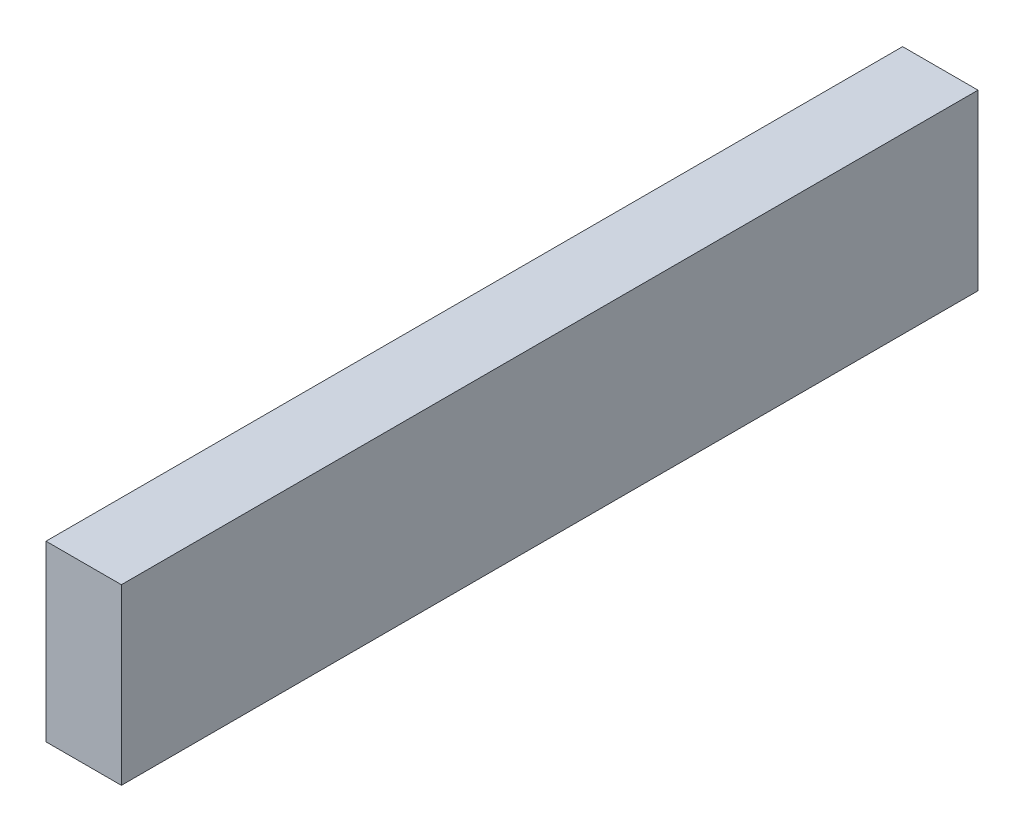
ISO-10303-21;
HEADER;
FILE_DESCRIPTION(('STEP AP214'),'2;1');
FILE_NAME('part.step','',(''),(''),'','','');
FILE_SCHEMA(('AUTOMOTIVE_DESIGN { 1 0 10303 214 1 1 1 1 }'));
ENDSEC;
DATA;
#1=APPLICATION_CONTEXT('core data for automotive mechanical design processes');
#2=APPLICATION_PROTOCOL_DEFINITION('international standard','automotive_design',2000,#1);
#3=PRODUCT_CONTEXT('',#1,'mechanical');
#4=PRODUCT('Part','Part','',(#3));
#5=PRODUCT_RELATED_PRODUCT_CATEGORY('part','',(#4));
#6=PRODUCT_DEFINITION_FORMATION('','',#4);
#7=PRODUCT_DEFINITION_CONTEXT('part definition',#1,'design');
#8=PRODUCT_DEFINITION('design','',#6,#7);
#9=PRODUCT_DEFINITION_SHAPE('','',#8);
#10=(LENGTH_UNIT() NAMED_UNIT(*) SI_UNIT(.MILLI.,.METRE.));
#11=(NAMED_UNIT(*) PLANE_ANGLE_UNIT() SI_UNIT($,.RADIAN.));
#12=(NAMED_UNIT(*) SI_UNIT($,.STERADIAN.) SOLID_ANGLE_UNIT());
#13=UNCERTAINTY_MEASURE_WITH_UNIT(LENGTH_MEASURE(1.E-05),#10,'distance_accuracy_value','');
#14=(GEOMETRIC_REPRESENTATION_CONTEXT(3) GLOBAL_UNCERTAINTY_ASSIGNED_CONTEXT((#13)) GLOBAL_UNIT_ASSIGNED_CONTEXT((#10,
#11,#12)) REPRESENTATION_CONTEXT('',''));
#15=CARTESIAN_POINT('',(0.,0.,0.));
#16=DIRECTION('',(0.,0.,1.));
#17=DIRECTION('',(1.,0.,0.));
#18=AXIS2_PLACEMENT_3D('',#15,#16,#17);
#19=CARTESIAN_POINT('',(0.,0.,431.8));
#20=DIRECTION('',(0.,1.,0.));
#21=DIRECTION('',(-1.,0.,0.));
#22=AXIS2_PLACEMENT_3D('',#19,#20,#21);
#23=PLANE('',#22);
#24=DIRECTION('',(1.,0.,0.));
#25=VECTOR('',#24,1.);
#26=CARTESIAN_POINT('',(0.,0.,0.));
#27=LINE('',#26,#25);
#28=CARTESIAN_POINT('',(-38.,0.,0.));
#29=VERTEX_POINT('',#28);
#30=CARTESIAN_POINT('',(0.,0.,0.));
#31=VERTEX_POINT('',#30);
#32=EDGE_CURVE('E113',#29,#31,#27,.T.);
#33=ORIENTED_EDGE('',*,*,#32,.T.);
#34=DIRECTION('',(0.,0.,-1.));
#35=VECTOR('',#34,1.);
#36=CARTESIAN_POINT('',(0.,0.,431.8));
#37=LINE('',#36,#35);
#38=CARTESIAN_POINT('',(0.,0.,431.8));
#39=VERTEX_POINT('',#38);
#40=EDGE_CURVE('E11',#39,#31,#37,.T.);
#41=ORIENTED_EDGE('',*,*,#40,.F.);
#42=DIRECTION('',(1.,0.,0.));
#43=VECTOR('',#42,1.);
#44=CARTESIAN_POINT('',(0.,0.,431.8));
#45=LINE('',#44,#43);
#46=CARTESIAN_POINT('',(-38.,0.,431.8));
#47=VERTEX_POINT('',#46);
#48=EDGE_CURVE('E97',#47,#39,#45,.T.);
#49=ORIENTED_EDGE('',*,*,#48,.F.);
#50=DIRECTION('',(0.,0.,-1.));
#51=VECTOR('',#50,1.);
#52=CARTESIAN_POINT('',(-38.,0.,431.8));
#53=LINE('',#52,#51);
#54=EDGE_CURVE('E109',#47,#29,#53,.T.);
#55=ORIENTED_EDGE('',*,*,#54,.T.);
#56=EDGE_LOOP('',(#33,#41,#49,#55));
#57=FACE_BOUND('',#56,.T.);
#58=ADVANCED_FACE('F45',(#57),#23,.F.);
#59=CARTESIAN_POINT('',(0.,0.,431.8));
#60=DIRECTION('',(-1.,0.,0.));
#61=DIRECTION('',(0.,0.,1.));
#62=AXIS2_PLACEMENT_3D('',#59,#60,#61);
#63=PLANE('',#62);
#64=DIRECTION('',(0.,1.,0.));
#65=VECTOR('',#64,1.);
#66=CARTESIAN_POINT('',(0.,0.,0.));
#67=LINE('',#66,#65);
#68=CARTESIAN_POINT('',(0.,87.6,0.));
#69=VERTEX_POINT('',#68);
#70=EDGE_CURVE('E102',#31,#69,#67,.T.);
#71=ORIENTED_EDGE('',*,*,#70,.T.);
#72=DIRECTION('',(0.,0.,-1.));
#73=VECTOR('',#72,1.);
#74=CARTESIAN_POINT('',(0.,87.6,431.8));
#75=LINE('',#74,#73);
#76=CARTESIAN_POINT('',(0.,87.6,431.8));
#77=VERTEX_POINT('',#76);
#78=EDGE_CURVE('E54',#77,#69,#75,.T.);
#79=ORIENTED_EDGE('',*,*,#78,.F.);
#80=DIRECTION('',(0.,1.,0.));
#81=VECTOR('',#80,1.);
#82=CARTESIAN_POINT('',(0.,0.,431.8));
#83=LINE('',#82,#81);
#84=EDGE_CURVE('E92',#39,#77,#83,.T.);
#85=ORIENTED_EDGE('',*,*,#84,.F.);
#86=ORIENTED_EDGE('',*,*,#40,.T.);
#87=EDGE_LOOP('',(#71,#79,#85,#86));
#88=FACE_BOUND('',#87,.T.);
#89=ADVANCED_FACE('F101',(#88),#63,.F.);
#90=CARTESIAN_POINT('',(0.,87.6,431.8));
#91=DIRECTION('',(0.,-1.,0.));
#92=DIRECTION('',(1.,0.,0.));
#93=AXIS2_PLACEMENT_3D('',#90,#91,#92);
#94=PLANE('',#93);
#95=DIRECTION('',(-1.,0.,0.));
#96=VECTOR('',#95,1.);
#97=CARTESIAN_POINT('',(0.,87.6,0.));
#98=LINE('',#97,#96);
#99=CARTESIAN_POINT('',(-38.,87.6,0.));
#100=VERTEX_POINT('',#99);
#101=EDGE_CURVE('E79',#69,#100,#98,.T.);
#102=ORIENTED_EDGE('',*,*,#101,.T.);
#103=DIRECTION('',(0.,0.,-1.));
#104=VECTOR('',#103,1.);
#105=CARTESIAN_POINT('',(-38.,87.6,431.8));
#106=LINE('',#105,#104);
#107=CARTESIAN_POINT('',(-38.,87.6,431.8));
#108=VERTEX_POINT('',#107);
#109=EDGE_CURVE('E104',#108,#100,#106,.T.);
#110=ORIENTED_EDGE('',*,*,#109,.F.);
#111=DIRECTION('',(-1.,0.,0.));
#112=VECTOR('',#111,1.);
#113=CARTESIAN_POINT('',(0.,87.6,431.8));
#114=LINE('',#113,#112);
#115=EDGE_CURVE('E95',#77,#108,#114,.T.);
#116=ORIENTED_EDGE('',*,*,#115,.F.);
#117=ORIENTED_EDGE('',*,*,#78,.T.);
#118=EDGE_LOOP('',(#102,#110,#116,#117));
#119=FACE_BOUND('',#118,.T.);
#120=ADVANCED_FACE('F105',(#119),#94,.F.);
#121=CARTESIAN_POINT('',(-38.,0.,431.8));
#122=DIRECTION('',(1.,0.,0.));
#123=DIRECTION('',(0.,0.,-1.));
#124=AXIS2_PLACEMENT_3D('',#121,#122,#123);
#125=PLANE('',#124);
#126=DIRECTION('',(0.,-1.,0.));
#127=VECTOR('',#126,1.);
#128=CARTESIAN_POINT('',(-38.,0.,0.));
#129=LINE('',#128,#127);
#130=EDGE_CURVE('E85',#100,#29,#129,.T.);
#131=ORIENTED_EDGE('',*,*,#130,.T.);
#132=ORIENTED_EDGE('',*,*,#54,.F.);
#133=DIRECTION('',(0.,-1.,0.));
#134=VECTOR('',#133,1.);
#135=CARTESIAN_POINT('',(-38.,0.,431.8));
#136=LINE('',#135,#134);
#137=EDGE_CURVE('E62',#108,#47,#136,.T.);
#138=ORIENTED_EDGE('',*,*,#137,.F.);
#139=ORIENTED_EDGE('',*,*,#109,.T.);
#140=EDGE_LOOP('',(#131,#132,#138,#139));
#141=FACE_BOUND('',#140,.T.);
#142=ADVANCED_FACE('F126',(#141),#125,.F.);
#143=CARTESIAN_POINT('',(0.,0.,431.8));
#144=DIRECTION('',(0.,0.,-1.));
#145=DIRECTION('',(-1.,0.,0.));
#146=AXIS2_PLACEMENT_3D('',#143,#144,#145);
#147=PLANE('',#146);
#148=ORIENTED_EDGE('',*,*,#48,.T.);
#149=ORIENTED_EDGE('',*,*,#84,.T.);
#150=ORIENTED_EDGE('',*,*,#115,.T.);
#151=ORIENTED_EDGE('',*,*,#137,.T.);
#152=EDGE_LOOP('',(#148,#149,#150,#151));
#153=FACE_BOUND('',#152,.T.);
#154=ADVANCED_FACE('F93',(#153),#147,.F.);
#155=CARTESIAN_POINT('',(0.,0.,0.));
#156=DIRECTION('',(0.,0.,-1.));
#157=DIRECTION('',(-1.,0.,0.));
#158=AXIS2_PLACEMENT_3D('',#155,#156,#157);
#159=PLANE('',#158);
#160=ORIENTED_EDGE('',*,*,#32,.F.);
#161=ORIENTED_EDGE('',*,*,#130,.F.);
#162=ORIENTED_EDGE('',*,*,#101,.F.);
#163=ORIENTED_EDGE('',*,*,#70,.F.);
#164=EDGE_LOOP('',(#160,#161,#162,#163));
#165=FACE_BOUND('',#164,.T.);
#166=ADVANCED_FACE('F129',(#165),#159,.T.);
#167=CLOSED_SHELL('',(#58,#89,#120,#142,#154,#166));
#168=MANIFOLD_SOLID_BREP('B2',#167);
#169=ADVANCED_BREP_SHAPE_REPRESENTATION('',(#18,#168),#14);
#170=SHAPE_DEFINITION_REPRESENTATION(#9,#169);
ENDSEC;
END-ISO-10303-21;
